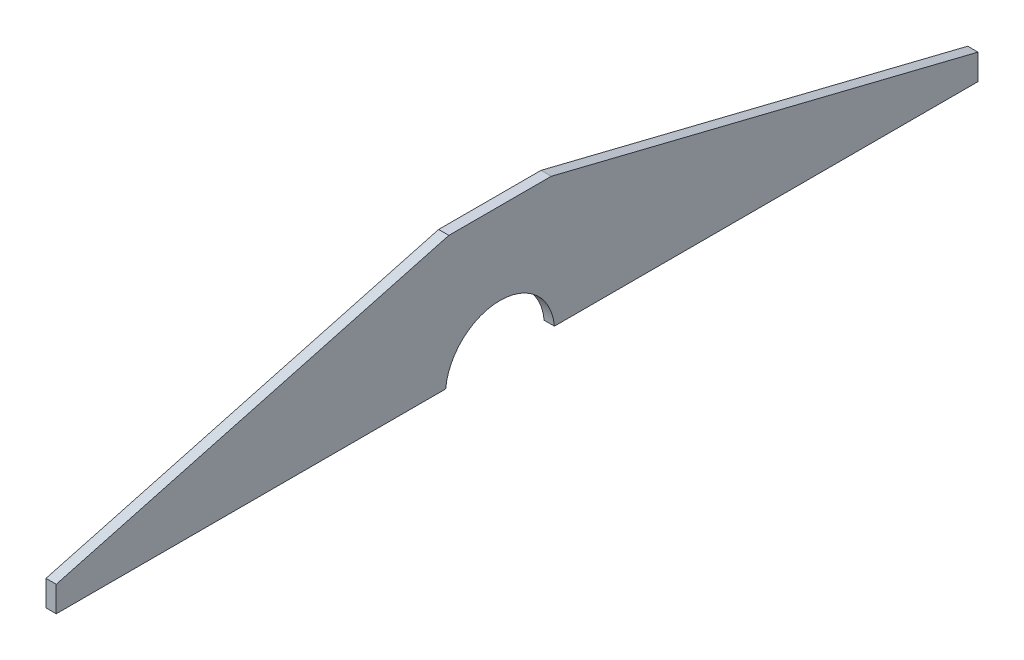
ISO-10303-21;
HEADER;
FILE_DESCRIPTION(('STEP AP214'),'2;1');
FILE_NAME('part.step','',(''),(''),'','','');
FILE_SCHEMA(('AUTOMOTIVE_DESIGN { 1 0 10303 214 1 1 1 1 }'));
ENDSEC;
DATA;
#1=APPLICATION_CONTEXT('core data for automotive mechanical design processes');
#2=APPLICATION_PROTOCOL_DEFINITION('international standard','automotive_design',2000,#1);
#3=PRODUCT_CONTEXT('',#1,'mechanical');
#4=PRODUCT('Part','Part','',(#3));
#5=PRODUCT_RELATED_PRODUCT_CATEGORY('part','',(#4));
#6=PRODUCT_DEFINITION_FORMATION('','',#4);
#7=PRODUCT_DEFINITION_CONTEXT('part definition',#1,'design');
#8=PRODUCT_DEFINITION('design','',#6,#7);
#9=PRODUCT_DEFINITION_SHAPE('','',#8);
#10=(LENGTH_UNIT() NAMED_UNIT(*) SI_UNIT(.MILLI.,.METRE.));
#11=(NAMED_UNIT(*) PLANE_ANGLE_UNIT() SI_UNIT($,.RADIAN.));
#12=(NAMED_UNIT(*) SI_UNIT($,.STERADIAN.) SOLID_ANGLE_UNIT());
#13=UNCERTAINTY_MEASURE_WITH_UNIT(LENGTH_MEASURE(1.E-05),#10,'distance_accuracy_value','');
#14=(GEOMETRIC_REPRESENTATION_CONTEXT(3) GLOBAL_UNCERTAINTY_ASSIGNED_CONTEXT((#13)) GLOBAL_UNIT_ASSIGNED_CONTEXT((#10,
#11,#12)) REPRESENTATION_CONTEXT('',''));
#15=CARTESIAN_POINT('',(0.,0.,0.));
#16=DIRECTION('',(0.,0.,1.));
#17=DIRECTION('',(1.,0.,0.));
#18=AXIS2_PLACEMENT_3D('',#15,#16,#17);
#19=CARTESIAN_POINT('',(-6.00000000000001,1.66533453693773E-13,0.));
#20=DIRECTION('',(1.,0.,0.));
#21=DIRECTION('',(0.,0.,-1.00000000000001));
#22=AXIS2_PLACEMENT_3D('',#19,#20,#21);
#23=CYLINDRICAL_SURFACE('',#22,32.);
#24=CARTESIAN_POINT('',(0.,0.,0.));
#25=DIRECTION('',(-1.,0.,0.));
#26=DIRECTION('',(0.,0.,-1.00000000000001));
#27=AXIS2_PLACEMENT_3D('',#24,#25,#26);
#28=CIRCLE('',#27,32.);
#29=CARTESIAN_POINT('',(-5.55111512312578E-13,3.00000000000017,31.8590646441478));
#30=VERTEX_POINT('',#29);
#31=CARTESIAN_POINT('',(-5.55111512312578E-13,3.00000000000034,-31.8590646441482));
#32=VERTEX_POINT('',#31);
#33=EDGE_CURVE('E129',#30,#32,#28,.T.);
#34=ORIENTED_EDGE('',*,*,#33,.F.);
#35=DIRECTION('',(1.,0.,0.));
#36=VECTOR('',#35,1.);
#37=CARTESIAN_POINT('',(-6.0000000000005,3.00000000000022,31.859064644148));
#38=LINE('',#37,#36);
#39=CARTESIAN_POINT('',(-6.0000000000005,3.00000000000022,31.859064644148));
#40=VERTEX_POINT('',#39);
#41=EDGE_CURVE('E11',#40,#30,#38,.T.);
#42=ORIENTED_EDGE('',*,*,#41,.F.);
#43=CARTESIAN_POINT('',(-6.00000000000001,1.66533453693773E-13,0.));
#44=DIRECTION('',(-1.,0.,0.));
#45=DIRECTION('',(0.,0.,-1.00000000000001));
#46=AXIS2_PLACEMENT_3D('',#43,#44,#45);
#47=CIRCLE('',#46,32.);
#48=CARTESIAN_POINT('',(-6.00000000000056,3.00000000000022,-31.8590646441485));
#49=VERTEX_POINT('',#48);
#50=EDGE_CURVE('E149',#40,#49,#47,.T.);
#51=ORIENTED_EDGE('',*,*,#50,.T.);
#52=DIRECTION('',(1.,0.,0.));
#53=VECTOR('',#52,1.);
#54=CARTESIAN_POINT('',(-6.00000000000056,3.00000000000022,-31.8590646441485));
#55=LINE('',#54,#53);
#56=EDGE_CURVE('E35',#49,#32,#55,.T.);
#57=ORIENTED_EDGE('',*,*,#56,.T.);
#58=EDGE_LOOP('',(#34,#42,#51,#57));
#59=FACE_BOUND('',#58,.T.);
#60=ADVANCED_FACE('F32',(#59),#23,.F.);
#61=CARTESIAN_POINT('',(-6.0000000000005,3.00000000000022,31.859064644148));
#62=DIRECTION('',(0.,-1.00000000000001,0.));
#63=DIRECTION('',(0.,0.,-1.00000000000001));
#64=AXIS2_PLACEMENT_3D('',#61,#62,#63);
#65=PLANE('',#64);
#66=DIRECTION('',(0.,0.,-1.00000000000001));
#67=VECTOR('',#66,1.);
#68=CARTESIAN_POINT('',(-5.55111512312578E-13,3.00000000000017,31.8590646441478));
#69=LINE('',#68,#67);
#70=CARTESIAN_POINT('',(-5.55111512312578E-13,3.00000000000039,260.000000000003));
#71=VERTEX_POINT('',#70);
#72=EDGE_CURVE('E147',#71,#30,#69,.T.);
#73=ORIENTED_EDGE('',*,*,#72,.F.);
#74=DIRECTION('',(1.,0.,0.));
#75=VECTOR('',#74,1.);
#76=CARTESIAN_POINT('',(-6.00000000000056,3.00000000000034,260.000000000003));
#77=LINE('',#76,#75);
#78=CARTESIAN_POINT('',(-6.00000000000056,3.00000000000034,260.000000000003));
#79=VERTEX_POINT('',#78);
#80=EDGE_CURVE('E41',#79,#71,#77,.T.);
#81=ORIENTED_EDGE('',*,*,#80,.F.);
#82=DIRECTION('',(0.,0.,-1.00000000000001));
#83=VECTOR('',#82,1.);
#84=CARTESIAN_POINT('',(-6.0000000000005,3.00000000000022,31.859064644148));
#85=LINE('',#84,#83);
#86=EDGE_CURVE('E119',#79,#40,#85,.T.);
#87=ORIENTED_EDGE('',*,*,#86,.T.);
#88=ORIENTED_EDGE('',*,*,#41,.T.);
#89=EDGE_LOOP('',(#73,#81,#87,#88));
#90=FACE_BOUND('',#89,.T.);
#91=ADVANCED_FACE('F161',(#90),#65,.T.);
#92=CARTESIAN_POINT('',(-6.00000000000056,3.00000000000034,260.000000000003));
#93=DIRECTION('',(0.,0.,1.00000000000001));
#94=DIRECTION('',(1.,0.,0.));
#95=AXIS2_PLACEMENT_3D('',#92,#93,#94);
#96=PLANE('',#95);
#97=DIRECTION('',(0.,-1.00000000000001,0.));
#98=VECTOR('',#97,1.);
#99=CARTESIAN_POINT('',(-5.55111512312578E-13,3.00000000000039,260.000000000003));
#100=LINE('',#99,#98);
#101=CARTESIAN_POINT('',(-5.55111512312578E-13,18.0000000000005,260.000000000003));
#102=VERTEX_POINT('',#101);
#103=EDGE_CURVE('E106',#102,#71,#100,.T.);
#104=ORIENTED_EDGE('',*,*,#103,.F.);
#105=DIRECTION('',(1.,0.,0.));
#106=VECTOR('',#105,1.);
#107=CARTESIAN_POINT('',(-6.00000000000056,18.0000000000002,260.000000000003));
#108=LINE('',#107,#106);
#109=CARTESIAN_POINT('',(-6.00000000000056,18.0000000000002,260.000000000003));
#110=VERTEX_POINT('',#109);
#111=EDGE_CURVE('E101',#110,#102,#108,.T.);
#112=ORIENTED_EDGE('',*,*,#111,.F.);
#113=DIRECTION('',(0.,-1.00000000000001,0.));
#114=VECTOR('',#113,1.);
#115=CARTESIAN_POINT('',(-6.00000000000056,3.00000000000034,260.000000000003));
#116=LINE('',#115,#114);
#117=EDGE_CURVE('E104',#110,#79,#116,.T.);
#118=ORIENTED_EDGE('',*,*,#117,.T.);
#119=ORIENTED_EDGE('',*,*,#80,.T.);
#120=EDGE_LOOP('',(#104,#112,#118,#119));
#121=FACE_BOUND('',#120,.T.);
#122=ADVANCED_FACE('F103',(#121),#96,.T.);
#123=CARTESIAN_POINT('',(-6.00000000000056,18.0000000000002,260.000000000003));
#124=DIRECTION('',(0.,0.965534647198904,0.260274557071009));
#125=DIRECTION('',(0.,-0.260274557071009,0.965534647198904));
#126=AXIS2_PLACEMENT_3D('',#123,#124,#125);
#127=PLANE('',#126);
#128=DIRECTION('',(0.,-0.260274557071009,0.965534647198904));
#129=VECTOR('',#128,1.);
#130=CARTESIAN_POINT('',(-5.55111512312578E-13,18.0000000000005,260.000000000003));
#131=LINE('',#130,#129);
#132=CARTESIAN_POINT('',(0.,80.0000000000012,30.0000000000001));
#133=VERTEX_POINT('',#132);
#134=EDGE_CURVE('E144',#133,#102,#131,.T.);
#135=ORIENTED_EDGE('',*,*,#134,.F.);
#136=DIRECTION('',(1.,0.,0.));
#137=VECTOR('',#136,1.);
#138=CARTESIAN_POINT('',(-6.00000000000001,80.0000000000011,30.0000000000001));
#139=LINE('',#138,#137);
#140=CARTESIAN_POINT('',(-6.00000000000001,80.0000000000011,30.0000000000001));
#141=VERTEX_POINT('',#140);
#142=EDGE_CURVE('E111',#141,#133,#139,.T.);
#143=ORIENTED_EDGE('',*,*,#142,.F.);
#144=DIRECTION('',(0.,-0.260274557071009,0.965534647198904));
#145=VECTOR('',#144,1.);
#146=CARTESIAN_POINT('',(-6.00000000000056,18.0000000000002,260.000000000003));
#147=LINE('',#146,#145);
#148=EDGE_CURVE('E117',#141,#110,#147,.T.);
#149=ORIENTED_EDGE('',*,*,#148,.T.);
#150=ORIENTED_EDGE('',*,*,#111,.T.);
#151=EDGE_LOOP('',(#135,#143,#149,#150));
#152=FACE_BOUND('',#151,.T.);
#153=ADVANCED_FACE('F121',(#152),#127,.T.);
#154=CARTESIAN_POINT('',(-6.00000000000001,80.0000000000011,30.0000000000001));
#155=DIRECTION('',(0.,1.00000000000001,0.));
#156=DIRECTION('',(0.,0.,1.00000000000001));
#157=AXIS2_PLACEMENT_3D('',#154,#155,#156);
#158=PLANE('',#157);
#159=DIRECTION('',(0.,0.,1.00000000000001));
#160=VECTOR('',#159,1.);
#161=CARTESIAN_POINT('',(0.,80.0000000000012,30.0000000000001));
#162=LINE('',#161,#160);
#163=CARTESIAN_POINT('',(0.,80.0000000000012,-30.0000000000003));
#164=VERTEX_POINT('',#163);
#165=EDGE_CURVE('E141',#164,#133,#162,.T.);
#166=ORIENTED_EDGE('',*,*,#165,.F.);
#167=DIRECTION('',(1.,0.,0.));
#168=VECTOR('',#167,1.);
#169=CARTESIAN_POINT('',(-6.00000000000001,80.0000000000009,-30.0000000000004));
#170=LINE('',#169,#168);
#171=CARTESIAN_POINT('',(-6.00000000000001,80.0000000000009,-30.0000000000004));
#172=VERTEX_POINT('',#171);
#173=EDGE_CURVE('E153',#172,#164,#170,.T.);
#174=ORIENTED_EDGE('',*,*,#173,.F.);
#175=DIRECTION('',(0.,0.,1.00000000000001));
#176=VECTOR('',#175,1.);
#177=CARTESIAN_POINT('',(-6.00000000000001,80.0000000000011,30.0000000000001));
#178=LINE('',#177,#176);
#179=EDGE_CURVE('E122',#172,#141,#178,.T.);
#180=ORIENTED_EDGE('',*,*,#179,.T.);
#181=ORIENTED_EDGE('',*,*,#142,.T.);
#182=EDGE_LOOP('',(#166,#174,#180,#181));
#183=FACE_BOUND('',#182,.T.);
#184=ADVANCED_FACE('F174',(#183),#158,.T.);
#185=CARTESIAN_POINT('',(-6.00000000000001,80.0000000000009,-30.0000000000004));
#186=DIRECTION('',(0.,0.970597531580749,-0.240708187832026));
#187=DIRECTION('',(0.,0.240708187832026,0.970597531580749));
#188=AXIS2_PLACEMENT_3D('',#185,#186,#187);
#189=PLANE('',#188);
#190=DIRECTION('',(0.,0.240708187832026,0.970597531580749));
#191=VECTOR('',#190,1.);
#192=CARTESIAN_POINT('',(0.,80.0000000000012,-30.0000000000003));
#193=LINE('',#192,#191);
#194=CARTESIAN_POINT('',(0.,18.0000000000008,-280.000000000003));
#195=VERTEX_POINT('',#194);
#196=EDGE_CURVE('E138',#195,#164,#193,.T.);
#197=ORIENTED_EDGE('',*,*,#196,.F.);
#198=DIRECTION('',(1.,0.,0.));
#199=VECTOR('',#198,1.);
#200=CARTESIAN_POINT('',(-6.00000000000001,18.0000000000005,-280.000000000003));
#201=LINE('',#200,#199);
#202=CARTESIAN_POINT('',(-6.00000000000001,18.0000000000005,-280.000000000003));
#203=VERTEX_POINT('',#202);
#204=EDGE_CURVE('E155',#203,#195,#201,.T.);
#205=ORIENTED_EDGE('',*,*,#204,.F.);
#206=DIRECTION('',(0.,0.240708187832026,0.970597531580749));
#207=VECTOR('',#206,1.);
#208=CARTESIAN_POINT('',(-6.00000000000001,80.0000000000009,-30.0000000000004));
#209=LINE('',#208,#207);
#210=EDGE_CURVE('E124',#203,#172,#209,.T.);
#211=ORIENTED_EDGE('',*,*,#210,.T.);
#212=ORIENTED_EDGE('',*,*,#173,.T.);
#213=EDGE_LOOP('',(#197,#205,#211,#212));
#214=FACE_BOUND('',#213,.T.);
#215=ADVANCED_FACE('F177',(#214),#189,.T.);
#216=CARTESIAN_POINT('',(-6.00000000000001,18.0000000000005,-280.000000000003));
#217=DIRECTION('',(0.,0.,-1.00000000000001));
#218=DIRECTION('',(-1.,0.,0.));
#219=AXIS2_PLACEMENT_3D('',#216,#217,#218);
#220=PLANE('',#219);
#221=DIRECTION('',(0.,1.00000000000001,0.));
#222=VECTOR('',#221,1.);
#223=CARTESIAN_POINT('',(0.,18.0000000000008,-280.000000000003));
#224=LINE('',#223,#222);
#225=CARTESIAN_POINT('',(0.,3.0000000000005,-280.000000000003));
#226=VERTEX_POINT('',#225);
#227=EDGE_CURVE('E135',#226,#195,#224,.T.);
#228=ORIENTED_EDGE('',*,*,#227,.F.);
#229=DIRECTION('',(1.,0.,0.));
#230=VECTOR('',#229,1.);
#231=CARTESIAN_POINT('',(-6.00000000000001,3.00000000000028,-280.000000000003));
#232=LINE('',#231,#230);
#233=CARTESIAN_POINT('',(-6.00000000000001,3.00000000000028,-280.000000000003));
#234=VERTEX_POINT('',#233);
#235=EDGE_CURVE('E156',#234,#226,#232,.T.);
#236=ORIENTED_EDGE('',*,*,#235,.F.);
#237=DIRECTION('',(0.,1.00000000000001,0.));
#238=VECTOR('',#237,1.);
#239=CARTESIAN_POINT('',(-6.00000000000001,18.0000000000005,-280.000000000003));
#240=LINE('',#239,#238);
#241=EDGE_CURVE('E252',#234,#203,#240,.T.);
#242=ORIENTED_EDGE('',*,*,#241,.T.);
#243=ORIENTED_EDGE('',*,*,#204,.T.);
#244=EDGE_LOOP('',(#228,#236,#242,#243));
#245=FACE_BOUND('',#244,.T.);
#246=ADVANCED_FACE('F181',(#245),#220,.T.);
#247=CARTESIAN_POINT('',(-6.00000000000001,3.00000000000028,-280.000000000003));
#248=DIRECTION('',(0.,-1.00000000000001,0.));
#249=DIRECTION('',(0.,0.,-1.00000000000001));
#250=AXIS2_PLACEMENT_3D('',#247,#248,#249);
#251=PLANE('',#250);
#252=DIRECTION('',(0.,0.,-1.00000000000001));
#253=VECTOR('',#252,1.);
#254=CARTESIAN_POINT('',(0.,3.0000000000005,-280.000000000003));
#255=LINE('',#254,#253);
#256=EDGE_CURVE('E132',#32,#226,#255,.T.);
#257=ORIENTED_EDGE('',*,*,#256,.F.);
#258=ORIENTED_EDGE('',*,*,#56,.F.);
#259=DIRECTION('',(0.,0.,-1.00000000000001));
#260=VECTOR('',#259,1.);
#261=CARTESIAN_POINT('',(-6.00000000000001,3.00000000000028,-280.000000000003));
#262=LINE('',#261,#260);
#263=EDGE_CURVE('E253',#49,#234,#262,.T.);
#264=ORIENTED_EDGE('',*,*,#263,.T.);
#265=ORIENTED_EDGE('',*,*,#235,.T.);
#266=EDGE_LOOP('',(#257,#258,#264,#265));
#267=FACE_BOUND('',#266,.T.);
#268=ADVANCED_FACE('F158',(#267),#251,.T.);
#269=CARTESIAN_POINT('',(-6.00000000000001,1.66533453693773E-13,0.));
#270=DIRECTION('',(1.,0.,0.));
#271=DIRECTION('',(0.,0.,-1.00000000000001));
#272=AXIS2_PLACEMENT_3D('',#269,#270,#271);
#273=PLANE('',#272);
#274=ORIENTED_EDGE('',*,*,#50,.F.);
#275=ORIENTED_EDGE('',*,*,#86,.F.);
#276=ORIENTED_EDGE('',*,*,#117,.F.);
#277=ORIENTED_EDGE('',*,*,#148,.F.);
#278=ORIENTED_EDGE('',*,*,#179,.F.);
#279=ORIENTED_EDGE('',*,*,#210,.F.);
#280=ORIENTED_EDGE('',*,*,#241,.F.);
#281=ORIENTED_EDGE('',*,*,#263,.F.);
#282=EDGE_LOOP('',(#274,#275,#276,#277,#278,#279,#280,#281));
#283=FACE_BOUND('',#282,.T.);
#284=ADVANCED_FACE('F115',(#283),#273,.F.);
#285=CARTESIAN_POINT('',(0.,0.,0.));
#286=DIRECTION('',(1.,0.,0.));
#287=DIRECTION('',(0.,0.,-1.00000000000001));
#288=AXIS2_PLACEMENT_3D('',#285,#286,#287);
#289=PLANE('',#288);
#290=ORIENTED_EDGE('',*,*,#33,.T.);
#291=ORIENTED_EDGE('',*,*,#256,.T.);
#292=ORIENTED_EDGE('',*,*,#227,.T.);
#293=ORIENTED_EDGE('',*,*,#196,.T.);
#294=ORIENTED_EDGE('',*,*,#165,.T.);
#295=ORIENTED_EDGE('',*,*,#134,.T.);
#296=ORIENTED_EDGE('',*,*,#103,.T.);
#297=ORIENTED_EDGE('',*,*,#72,.T.);
#298=EDGE_LOOP('',(#290,#291,#292,#293,#294,#295,#296,#297));
#299=FACE_BOUND('',#298,.T.);
#300=ADVANCED_FACE('F160',(#299),#289,.T.);
#301=CLOSED_SHELL('',(#60,#91,#122,#153,#184,#215,#246,#268,#284,#300));
#302=MANIFOLD_SOLID_BREP('B2',#301);
#303=ADVANCED_BREP_SHAPE_REPRESENTATION('',(#18,#302),#14);
#304=SHAPE_DEFINITION_REPRESENTATION(#9,#303);
ENDSEC;
END-ISO-10303-21;
